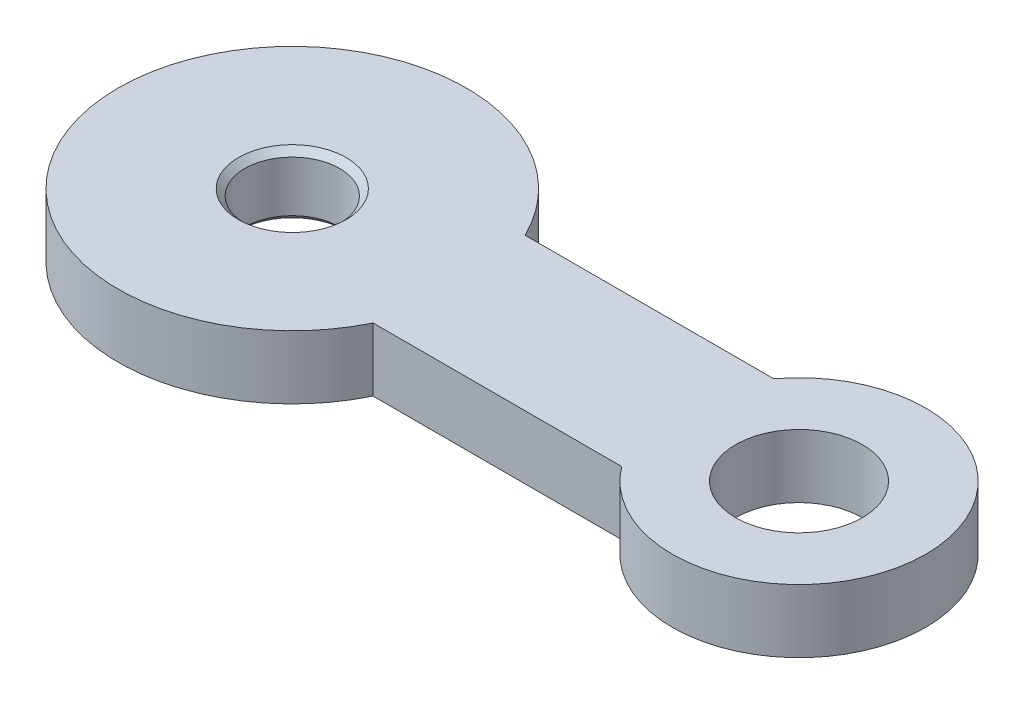
ISO-10303-21;
HEADER;
FILE_DESCRIPTION(('STEP AP214'),'2;1');
FILE_NAME('part.step','',(''),(''),'','','');
FILE_SCHEMA(('AUTOMOTIVE_DESIGN { 1 0 10303 214 1 1 1 1 }'));
ENDSEC;
DATA;
#1=APPLICATION_CONTEXT('core data for automotive mechanical design processes');
#2=APPLICATION_PROTOCOL_DEFINITION('international standard','automotive_design',2000,#1);
#3=PRODUCT_CONTEXT('',#1,'mechanical');
#4=PRODUCT('Part','Part','',(#3));
#5=PRODUCT_RELATED_PRODUCT_CATEGORY('part','',(#4));
#6=PRODUCT_DEFINITION_FORMATION('','',#4);
#7=PRODUCT_DEFINITION_CONTEXT('part definition',#1,'design');
#8=PRODUCT_DEFINITION('design','',#6,#7);
#9=PRODUCT_DEFINITION_SHAPE('','',#8);
#10=(LENGTH_UNIT() NAMED_UNIT(*) SI_UNIT(.MILLI.,.METRE.));
#11=(NAMED_UNIT(*) PLANE_ANGLE_UNIT() SI_UNIT($,.RADIAN.));
#12=(NAMED_UNIT(*) SI_UNIT($,.STERADIAN.) SOLID_ANGLE_UNIT());
#13=UNCERTAINTY_MEASURE_WITH_UNIT(LENGTH_MEASURE(1.E-05),#10,'distance_accuracy_value','');
#14=(GEOMETRIC_REPRESENTATION_CONTEXT(3) GLOBAL_UNCERTAINTY_ASSIGNED_CONTEXT((#13)) GLOBAL_UNIT_ASSIGNED_CONTEXT((#10,
#11,#12)) REPRESENTATION_CONTEXT('',''));
#15=CARTESIAN_POINT('',(0.,0.,0.));
#16=DIRECTION('',(0.,0.,1.));
#17=DIRECTION('',(1.,0.,0.));
#18=AXIS2_PLACEMENT_3D('',#15,#16,#17);
#19=CARTESIAN_POINT('',(101.6,12.7,0.));
#20=DIRECTION('',(0.,1.,0.));
#21=DIRECTION('',(0.,0.,1.));
#22=AXIS2_PLACEMENT_3D('',#19,#20,#21);
#23=PLANE('',#22);
#24=CARTESIAN_POINT('',(0.,12.7,0.));
#25=DIRECTION('',(0.,1.,0.));
#26=DIRECTION('',(0.,0.,1.));
#27=AXIS2_PLACEMENT_3D('',#24,#25,#26);
#28=CIRCLE('',#27,10.795);
#29=CARTESIAN_POINT('',(0.,12.7,10.795));
#30=VERTEX_POINT('',#29);
#31=EDGE_CURVE('E11',#30,#30,#28,.F.);
#32=ORIENTED_EDGE('',*,*,#31,.T.);
#33=EDGE_LOOP('',(#32));
#34=FACE_BOUND('',#33,.T.);
#35=CARTESIAN_POINT('',(101.6,12.7,0.));
#36=DIRECTION('',(0.,1.,0.));
#37=DIRECTION('',(0.,0.,1.));
#38=AXIS2_PLACEMENT_3D('',#35,#36,#37);
#39=CIRCLE('',#38,25.4);
#40=CARTESIAN_POINT('',(81.28,12.7,15.24));
#41=VERTEX_POINT('',#40);
#42=CARTESIAN_POINT('',(81.28,12.7,-15.24));
#43=VERTEX_POINT('',#42);
#44=EDGE_CURVE('E86',#41,#43,#39,.T.);
#45=ORIENTED_EDGE('',*,*,#44,.T.);
#46=DIRECTION('',(-1.,0.,0.));
#47=VECTOR('',#46,1.);
#48=CARTESIAN_POINT('',(31.4244813004129,12.7,-15.24));
#49=LINE('',#48,#47);
#50=CARTESIAN_POINT('',(31.4244813004129,12.7,-15.24));
#51=VERTEX_POINT('',#50);
#52=EDGE_CURVE('E81',#43,#51,#49,.T.);
#53=ORIENTED_EDGE('',*,*,#52,.T.);
#54=CARTESIAN_POINT('',(0.,12.7,0.));
#55=DIRECTION('',(0.,1.,0.));
#56=DIRECTION('',(0.,0.,1.));
#57=AXIS2_PLACEMENT_3D('',#54,#55,#56);
#58=CIRCLE('',#57,34.925);
#59=CARTESIAN_POINT('',(31.4244813004129,12.7,15.24));
#60=VERTEX_POINT('',#59);
#61=EDGE_CURVE('E84',#51,#60,#58,.T.);
#62=ORIENTED_EDGE('',*,*,#61,.T.);
#63=DIRECTION('',(1.,0.,0.));
#64=VECTOR('',#63,1.);
#65=CARTESIAN_POINT('',(81.28,12.7,15.24));
#66=LINE('',#65,#64);
#67=EDGE_CURVE('E50',#60,#41,#66,.T.);
#68=ORIENTED_EDGE('',*,*,#67,.T.);
#69=EDGE_LOOP('',(#45,#53,#62,#68));
#70=FACE_BOUND('',#69,.T.);
#71=CARTESIAN_POINT('',(101.6,12.7,0.));
#72=DIRECTION('',(0.,1.,0.));
#73=DIRECTION('',(0.,0.,1.));
#74=AXIS2_PLACEMENT_3D('',#71,#72,#73);
#75=CIRCLE('',#74,12.7);
#76=CARTESIAN_POINT('',(101.6,12.7,12.7));
#77=VERTEX_POINT('',#76);
#78=EDGE_CURVE('E104',#77,#77,#75,.T.);
#79=ORIENTED_EDGE('',*,*,#78,.F.);
#80=EDGE_LOOP('',(#79));
#81=FACE_BOUND('',#80,.T.);
#82=ADVANCED_FACE('F33',(#34,#70,#81),#23,.T.);
#83=CARTESIAN_POINT('',(101.6,0.,0.));
#84=DIRECTION('',(0.,1.,0.));
#85=DIRECTION('',(0.,0.,1.));
#86=AXIS2_PLACEMENT_3D('',#83,#84,#85);
#87=PLANE('',#86);
#88=CARTESIAN_POINT('',(0.,0.,0.));
#89=DIRECTION('',(0.,1.,0.));
#90=DIRECTION('',(0.,0.,1.));
#91=AXIS2_PLACEMENT_3D('',#88,#89,#90);
#92=CIRCLE('',#91,10.795);
#93=CARTESIAN_POINT('',(0.,0.,10.795));
#94=VERTEX_POINT('',#93);
#95=EDGE_CURVE('E111',#94,#94,#92,.T.);
#96=ORIENTED_EDGE('',*,*,#95,.T.);
#97=EDGE_LOOP('',(#96));
#98=FACE_BOUND('',#97,.T.);
#99=CARTESIAN_POINT('',(101.6,0.,0.));
#100=DIRECTION('',(0.,1.,0.));
#101=DIRECTION('',(0.,0.,1.));
#102=AXIS2_PLACEMENT_3D('',#99,#100,#101);
#103=CIRCLE('',#102,25.4);
#104=CARTESIAN_POINT('',(81.28,0.,15.24));
#105=VERTEX_POINT('',#104);
#106=CARTESIAN_POINT('',(81.28,0.,-15.24));
#107=VERTEX_POINT('',#106);
#108=EDGE_CURVE('E101',#105,#107,#103,.T.);
#109=ORIENTED_EDGE('',*,*,#108,.F.);
#110=DIRECTION('',(1.,0.,0.));
#111=VECTOR('',#110,1.);
#112=CARTESIAN_POINT('',(81.28,0.,15.24));
#113=LINE('',#112,#111);
#114=CARTESIAN_POINT('',(31.4244813004129,0.,15.24));
#115=VERTEX_POINT('',#114);
#116=EDGE_CURVE('E73',#115,#105,#113,.T.);
#117=ORIENTED_EDGE('',*,*,#116,.F.);
#118=CARTESIAN_POINT('',(0.,0.,0.));
#119=DIRECTION('',(0.,1.,0.));
#120=DIRECTION('',(0.,0.,1.));
#121=AXIS2_PLACEMENT_3D('',#118,#119,#120);
#122=CIRCLE('',#121,34.925);
#123=CARTESIAN_POINT('',(31.4244813004129,0.,-15.24));
#124=VERTEX_POINT('',#123);
#125=EDGE_CURVE('E67',#124,#115,#122,.T.);
#126=ORIENTED_EDGE('',*,*,#125,.F.);
#127=DIRECTION('',(-1.,0.,0.));
#128=VECTOR('',#127,1.);
#129=CARTESIAN_POINT('',(31.4244813004129,0.,-15.24));
#130=LINE('',#129,#128);
#131=EDGE_CURVE('E91',#107,#124,#130,.T.);
#132=ORIENTED_EDGE('',*,*,#131,.F.);
#133=EDGE_LOOP('',(#109,#117,#126,#132));
#134=FACE_BOUND('',#133,.T.);
#135=CARTESIAN_POINT('',(101.6,0.,0.));
#136=DIRECTION('',(0.,1.,0.));
#137=DIRECTION('',(0.,0.,1.));
#138=AXIS2_PLACEMENT_3D('',#135,#136,#137);
#139=CIRCLE('',#138,12.7);
#140=CARTESIAN_POINT('',(101.6,0.,12.7));
#141=VERTEX_POINT('',#140);
#142=EDGE_CURVE('E137',#141,#141,#139,.T.);
#143=ORIENTED_EDGE('',*,*,#142,.T.);
#144=EDGE_LOOP('',(#143));
#145=FACE_BOUND('',#144,.T.);
#146=ADVANCED_FACE('F128',(#98,#134,#145),#87,.F.);
#147=CARTESIAN_POINT('',(101.6,12.7,0.));
#148=DIRECTION('',(0.,-1.,0.));
#149=DIRECTION('',(0.,0.,-1.));
#150=AXIS2_PLACEMENT_3D('',#147,#148,#149);
#151=CYLINDRICAL_SURFACE('',#150,25.4);
#152=ORIENTED_EDGE('',*,*,#108,.T.);
#153=DIRECTION('',(0.,-1.,0.));
#154=VECTOR('',#153,1.);
#155=CARTESIAN_POINT('',(81.28,12.7,-15.24));
#156=LINE('',#155,#154);
#157=EDGE_CURVE('E92',#43,#107,#156,.T.);
#158=ORIENTED_EDGE('',*,*,#157,.F.);
#159=ORIENTED_EDGE('',*,*,#44,.F.);
#160=DIRECTION('',(0.,-1.,0.));
#161=VECTOR('',#160,1.);
#162=CARTESIAN_POINT('',(81.28,12.7,15.24));
#163=LINE('',#162,#161);
#164=EDGE_CURVE('E97',#41,#105,#163,.T.);
#165=ORIENTED_EDGE('',*,*,#164,.T.);
#166=EDGE_LOOP('',(#152,#158,#159,#165));
#167=FACE_BOUND('',#166,.T.);
#168=ADVANCED_FACE('F131',(#167),#151,.T.);
#169=CARTESIAN_POINT('',(31.4244813004129,12.7,-15.24));
#170=DIRECTION('',(0.,0.,1.));
#171=DIRECTION('',(1.,0.,0.));
#172=AXIS2_PLACEMENT_3D('',#169,#170,#171);
#173=PLANE('',#172);
#174=ORIENTED_EDGE('',*,*,#131,.T.);
#175=DIRECTION('',(0.,-1.,0.));
#176=VECTOR('',#175,1.);
#177=CARTESIAN_POINT('',(31.4244813004129,12.7,-15.24));
#178=LINE('',#177,#176);
#179=EDGE_CURVE('E89',#51,#124,#178,.T.);
#180=ORIENTED_EDGE('',*,*,#179,.F.);
#181=ORIENTED_EDGE('',*,*,#52,.F.);
#182=ORIENTED_EDGE('',*,*,#157,.T.);
#183=EDGE_LOOP('',(#174,#180,#181,#182));
#184=FACE_BOUND('',#183,.T.);
#185=ADVANCED_FACE('F90',(#184),#173,.F.);
#186=CARTESIAN_POINT('',(0.,12.7,0.));
#187=DIRECTION('',(0.,-1.,0.));
#188=DIRECTION('',(0.,0.,-1.));
#189=AXIS2_PLACEMENT_3D('',#186,#187,#188);
#190=CYLINDRICAL_SURFACE('',#189,34.925);
#191=ORIENTED_EDGE('',*,*,#125,.T.);
#192=DIRECTION('',(0.,-1.,0.));
#193=VECTOR('',#192,1.);
#194=CARTESIAN_POINT('',(31.4244813004129,12.7,15.24));
#195=LINE('',#194,#193);
#196=EDGE_CURVE('E93',#60,#115,#195,.T.);
#197=ORIENTED_EDGE('',*,*,#196,.F.);
#198=ORIENTED_EDGE('',*,*,#61,.F.);
#199=ORIENTED_EDGE('',*,*,#179,.T.);
#200=EDGE_LOOP('',(#191,#197,#198,#199));
#201=FACE_BOUND('',#200,.T.);
#202=ADVANCED_FACE('F95',(#201),#190,.T.);
#203=CARTESIAN_POINT('',(81.28,12.7,15.24));
#204=DIRECTION('',(0.,0.,-1.));
#205=DIRECTION('',(-1.,0.,0.));
#206=AXIS2_PLACEMENT_3D('',#203,#204,#205);
#207=PLANE('',#206);
#208=ORIENTED_EDGE('',*,*,#116,.T.);
#209=ORIENTED_EDGE('',*,*,#164,.F.);
#210=ORIENTED_EDGE('',*,*,#67,.F.);
#211=ORIENTED_EDGE('',*,*,#196,.T.);
#212=EDGE_LOOP('',(#208,#209,#210,#211));
#213=FACE_BOUND('',#212,.T.);
#214=ADVANCED_FACE('F153',(#213),#207,.F.);
#215=CARTESIAN_POINT('',(0.,12.7,0.));
#216=DIRECTION('',(0.,-1.,0.));
#217=DIRECTION('',(0.,0.,-1.));
#218=AXIS2_PLACEMENT_3D('',#215,#216,#217);
#219=CYLINDRICAL_SURFACE('',#218,9.525);
#220=CARTESIAN_POINT('',(0.,1.26999999999999,0.));
#221=DIRECTION('',(0.,1.,0.));
#222=DIRECTION('',(0.,0.,1.));
#223=AXIS2_PLACEMENT_3D('',#220,#221,#222);
#224=CIRCLE('',#223,9.525);
#225=CARTESIAN_POINT('',(0.,1.26999999999999,9.525));
#226=VERTEX_POINT('',#225);
#227=EDGE_CURVE('E42',#226,#226,#224,.F.);
#228=ORIENTED_EDGE('',*,*,#227,.T.);
#229=EDGE_LOOP('',(#228));
#230=FACE_BOUND('',#229,.T.);
#231=CARTESIAN_POINT('',(0.,11.43,0.));
#232=DIRECTION('',(0.,1.,0.));
#233=DIRECTION('',(0.,0.,1.));
#234=AXIS2_PLACEMENT_3D('',#231,#232,#233);
#235=CIRCLE('',#234,9.525);
#236=CARTESIAN_POINT('',(0.,11.43,9.525));
#237=VERTEX_POINT('',#236);
#238=EDGE_CURVE('E114',#237,#237,#235,.T.);
#239=ORIENTED_EDGE('',*,*,#238,.T.);
#240=EDGE_LOOP('',(#239));
#241=FACE_BOUND('',#240,.T.);
#242=ADVANCED_FACE('F119',(#230,#241),#219,.F.);
#243=CARTESIAN_POINT('',(101.6,12.7,0.));
#244=DIRECTION('',(0.,-1.,0.));
#245=DIRECTION('',(0.,0.,-1.));
#246=AXIS2_PLACEMENT_3D('',#243,#244,#245);
#247=CYLINDRICAL_SURFACE('',#246,12.7);
#248=ORIENTED_EDGE('',*,*,#78,.T.);
#249=EDGE_LOOP('',(#248));
#250=FACE_BOUND('',#249,.T.);
#251=ORIENTED_EDGE('',*,*,#142,.F.);
#252=EDGE_LOOP('',(#251));
#253=FACE_BOUND('',#252,.T.);
#254=ADVANCED_FACE('F125',(#250,#253),#247,.F.);
#255=CARTESIAN_POINT('',(0.,0.,0.));
#256=DIRECTION('',(0.,-1.,0.));
#257=DIRECTION('',(0.,0.,-1.));
#258=AXIS2_PLACEMENT_3D('',#255,#256,#257);
#259=CONICAL_SURFACE('',#258,10.795,0.785398163397445);
#260=ORIENTED_EDGE('',*,*,#227,.F.);
#261=EDGE_LOOP('',(#260));
#262=FACE_BOUND('',#261,.T.);
#263=ORIENTED_EDGE('',*,*,#95,.F.);
#264=EDGE_LOOP('',(#263));
#265=FACE_BOUND('',#264,.T.);
#266=ADVANCED_FACE('F122',(#262,#265),#259,.F.);
#267=CARTESIAN_POINT('',(0.,11.43,0.));
#268=DIRECTION('',(0.,1.,0.));
#269=DIRECTION('',(0.,0.,1.));
#270=AXIS2_PLACEMENT_3D('',#267,#268,#269);
#271=CONICAL_SURFACE('',#270,9.525,0.785398163397452);
#272=ORIENTED_EDGE('',*,*,#31,.F.);
#273=EDGE_LOOP('',(#272));
#274=FACE_BOUND('',#273,.T.);
#275=ORIENTED_EDGE('',*,*,#238,.F.);
#276=EDGE_LOOP('',(#275));
#277=FACE_BOUND('',#276,.T.);
#278=ADVANCED_FACE('F35',(#274,#277),#271,.F.);
#279=CLOSED_SHELL('',(#82,#146,#168,#185,#202,#214,#242,#254,#266,#278));
#280=MANIFOLD_SOLID_BREP('B2',#279);
#281=ADVANCED_BREP_SHAPE_REPRESENTATION('',(#18,#280),#14);
#282=SHAPE_DEFINITION_REPRESENTATION(#9,#281);
ENDSEC;
END-ISO-10303-21;
